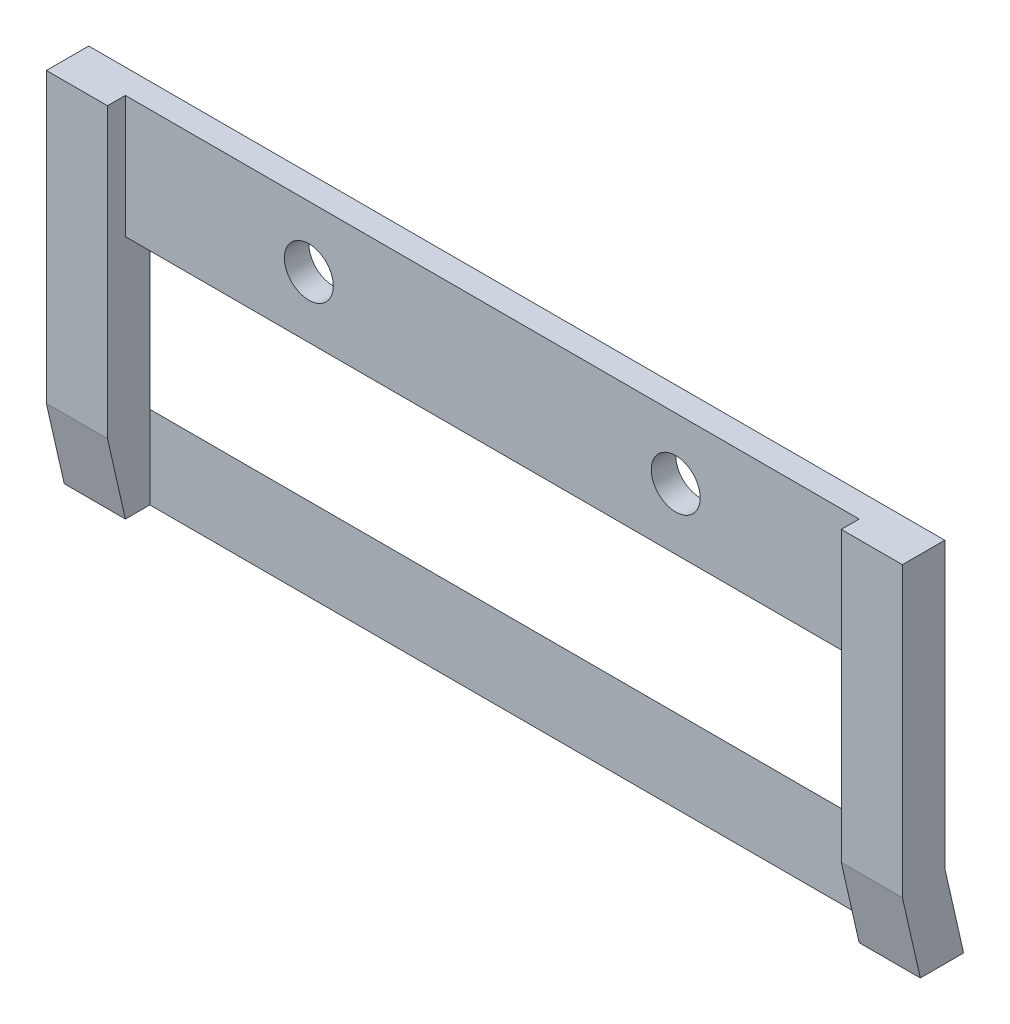
ISO-10303-21;
HEADER;
FILE_DESCRIPTION(('STEP AP214'),'2;1');
FILE_NAME('part.step','',(''),(''),'','','');
FILE_SCHEMA(('AUTOMOTIVE_DESIGN { 1 0 10303 214 1 1 1 1 }'));
ENDSEC;
DATA;
#1=APPLICATION_CONTEXT('core data for automotive mechanical design processes');
#2=APPLICATION_PROTOCOL_DEFINITION('international standard','automotive_design',2000,#1);
#3=PRODUCT_CONTEXT('',#1,'mechanical');
#4=PRODUCT('Part','Part','',(#3));
#5=PRODUCT_RELATED_PRODUCT_CATEGORY('part','',(#4));
#6=PRODUCT_DEFINITION_FORMATION('','',#4);
#7=PRODUCT_DEFINITION_CONTEXT('part definition',#1,'design');
#8=PRODUCT_DEFINITION('design','',#6,#7);
#9=PRODUCT_DEFINITION_SHAPE('','',#8);
#10=(LENGTH_UNIT() NAMED_UNIT(*) SI_UNIT(.MILLI.,.METRE.));
#11=(NAMED_UNIT(*) PLANE_ANGLE_UNIT() SI_UNIT($,.RADIAN.));
#12=(NAMED_UNIT(*) SI_UNIT($,.STERADIAN.) SOLID_ANGLE_UNIT());
#13=UNCERTAINTY_MEASURE_WITH_UNIT(LENGTH_MEASURE(1.E-05),#10,'distance_accuracy_value','');
#14=(GEOMETRIC_REPRESENTATION_CONTEXT(3) GLOBAL_UNCERTAINTY_ASSIGNED_CONTEXT((#13)) GLOBAL_UNIT_ASSIGNED_CONTEXT((#10,
#11,#12)) REPRESENTATION_CONTEXT('',''));
#15=CARTESIAN_POINT('',(0.,0.,0.));
#16=DIRECTION('',(0.,0.,1.));
#17=DIRECTION('',(1.,0.,0.));
#18=AXIS2_PLACEMENT_3D('',#15,#16,#17);
#19=CARTESIAN_POINT('',(0.,0.,0.));
#20=DIRECTION('',(0.,0.,-1.));
#21=DIRECTION('',(-1.,0.,0.));
#22=AXIS2_PLACEMENT_3D('',#19,#20,#21);
#23=PLANE('',#22);
#24=CARTESIAN_POINT('',(0.245106064920272,5.00000000000001,0.));
#25=DIRECTION('',(0.,0.,-1.));
#26=DIRECTION('',(-1.,0.,0.));
#27=AXIS2_PLACEMENT_3D('',#24,#25,#26);
#28=CIRCLE('',#27,2.);
#29=CARTESIAN_POINT('',(-1.75489393507973,5.00000000000001,0.));
#30=VERTEX_POINT('',#29);
#31=EDGE_CURVE('E38',#30,#30,#28,.F.);
#32=ORIENTED_EDGE('',*,*,#31,.T.);
#33=EDGE_LOOP('',(#32));
#34=FACE_BOUND('',#33,.T.);
#35=CARTESIAN_POINT('',(-29.7548939350797,5.,0.));
#36=DIRECTION('',(0.,0.,-1.));
#37=DIRECTION('',(-1.,0.,0.));
#38=AXIS2_PLACEMENT_3D('',#35,#36,#37);
#39=CIRCLE('',#38,2.);
#40=CARTESIAN_POINT('',(-31.7548939350797,5.,0.));
#41=VERTEX_POINT('',#40);
#42=EDGE_CURVE('E182',#41,#41,#39,.T.);
#43=ORIENTED_EDGE('',*,*,#42,.F.);
#44=EDGE_LOOP('',(#43));
#45=FACE_BOUND('',#44,.T.);
#46=DIRECTION('',(0.,1.,0.));
#47=VECTOR('',#46,1.);
#48=CARTESIAN_POINT('',(20.2451060649203,10.,0.));
#49=LINE('',#48,#47);
#50=CARTESIAN_POINT('',(20.2451060649203,-13.2253905657513,0.));
#51=VERTEX_POINT('',#50);
#52=CARTESIAN_POINT('',(20.2451060649203,10.,0.));
#53=VERTEX_POINT('',#52);
#54=EDGE_CURVE('E240',#51,#53,#49,.T.);
#55=ORIENTED_EDGE('',*,*,#54,.F.);
#56=DIRECTION('',(1.,0.,0.));
#57=VECTOR('',#56,1.);
#58=CARTESIAN_POINT('',(-51.7026371033491,-13.2253905657513,0.));
#59=LINE('',#58,#57);
#60=CARTESIAN_POINT('',(15.2451060649203,-13.2253905657513,0.));
#61=VERTEX_POINT('',#60);
#62=EDGE_CURVE('E167',#61,#51,#59,.T.);
#63=ORIENTED_EDGE('',*,*,#62,.F.);
#64=DIRECTION('',(0.,-1.,0.));
#65=VECTOR('',#64,1.);
#66=CARTESIAN_POINT('',(15.2451060649203,-20.,0.));
#67=LINE('',#66,#65);
#68=CARTESIAN_POINT('',(15.2451060649203,0.,0.));
#69=VERTEX_POINT('',#68);
#70=EDGE_CURVE('E237',#69,#61,#67,.T.);
#71=ORIENTED_EDGE('',*,*,#70,.F.);
#72=DIRECTION('',(1.,0.,0.));
#73=VECTOR('',#72,1.);
#74=CARTESIAN_POINT('',(-44.7548939350797,0.,0.));
#75=LINE('',#74,#73);
#76=CARTESIAN_POINT('',(-44.7548939350797,0.,0.));
#77=VERTEX_POINT('',#76);
#78=EDGE_CURVE('E145',#77,#69,#75,.T.);
#79=ORIENTED_EDGE('',*,*,#78,.F.);
#80=DIRECTION('',(0.,1.,0.));
#81=VECTOR('',#80,1.);
#82=CARTESIAN_POINT('',(-44.7548939350797,-20.,0.));
#83=LINE('',#82,#81);
#84=CARTESIAN_POINT('',(-44.7548939350797,-13.2253905657513,0.));
#85=VERTEX_POINT('',#84);
#86=EDGE_CURVE('E138',#85,#77,#83,.T.);
#87=ORIENTED_EDGE('',*,*,#86,.F.);
#88=DIRECTION('',(-1.,0.,0.));
#89=VECTOR('',#88,1.);
#90=CARTESIAN_POINT('',(-37.8071507668104,-13.2253905657513,0.));
#91=LINE('',#90,#89);
#92=CARTESIAN_POINT('',(-49.7548939350797,-13.2253905657513,0.));
#93=VERTEX_POINT('',#92);
#94=EDGE_CURVE('E142',#85,#93,#91,.T.);
#95=ORIENTED_EDGE('',*,*,#94,.T.);
#96=DIRECTION('',(0.,-1.,0.));
#97=VECTOR('',#96,1.);
#98=CARTESIAN_POINT('',(-49.7548939350797,9.99999999999999,0.));
#99=LINE('',#98,#97);
#100=CARTESIAN_POINT('',(-49.7548939350797,9.99999999999999,0.));
#101=VERTEX_POINT('',#100);
#102=EDGE_CURVE('E228',#101,#93,#99,.T.);
#103=ORIENTED_EDGE('',*,*,#102,.F.);
#104=DIRECTION('',(-1.,0.,0.));
#105=VECTOR('',#104,1.);
#106=CARTESIAN_POINT('',(-44.7548939350797,9.99999999999999,0.));
#107=LINE('',#106,#105);
#108=EDGE_CURVE('E242',#53,#101,#107,.T.);
#109=ORIENTED_EDGE('',*,*,#108,.F.);
#110=EDGE_LOOP('',(#55,#63,#71,#79,#87,#95,#103,#109));
#111=FACE_BOUND('',#110,.T.);
#112=ADVANCED_FACE('F34',(#34,#45,#111),#23,.T.);
#113=CARTESIAN_POINT('',(-44.7548939350797,-20.,2.));
#114=DIRECTION('',(-1.,0.,0.));
#115=DIRECTION('',(0.,0.,1.));
#116=AXIS2_PLACEMENT_3D('',#113,#114,#115);
#117=PLANE('',#116);
#118=DIRECTION('',(0.,1.,0.));
#119=VECTOR('',#118,1.);
#120=CARTESIAN_POINT('',(-44.7548939350797,-20.,0.));
#121=LINE('',#120,#119);
#122=CARTESIAN_POINT('',(-44.7548939350797,-20.,0.));
#123=VERTEX_POINT('',#122);
#124=EDGE_CURVE('E161',#123,#85,#121,.T.);
#125=ORIENTED_EDGE('',*,*,#124,.T.);
#126=ORIENTED_EDGE('',*,*,#86,.T.);
#127=DIRECTION('',(0.,0.,-1.));
#128=VECTOR('',#127,1.);
#129=CARTESIAN_POINT('',(-44.7548939350797,0.,2.));
#130=LINE('',#129,#128);
#131=CARTESIAN_POINT('',(-44.7548939350797,0.,2.));
#132=VERTEX_POINT('',#131);
#133=EDGE_CURVE('E11',#132,#77,#130,.T.);
#134=ORIENTED_EDGE('',*,*,#133,.F.);
#135=DIRECTION('',(0.,1.,0.));
#136=VECTOR('',#135,1.);
#137=CARTESIAN_POINT('',(-44.7548939350797,0.,2.));
#138=LINE('',#137,#136);
#139=CARTESIAN_POINT('',(-44.7548939350797,9.99999999999999,2.));
#140=VERTEX_POINT('',#139);
#141=EDGE_CURVE('E147',#132,#140,#138,.T.);
#142=ORIENTED_EDGE('',*,*,#141,.T.);
#143=DIRECTION('',(0.,0.,1.));
#144=VECTOR('',#143,1.);
#145=CARTESIAN_POINT('',(-44.7548939350797,9.99999999999999,3.46116455804052));
#146=LINE('',#145,#144);
#147=CARTESIAN_POINT('',(-44.7548939350797,10.,3.46116455804052));
#148=VERTEX_POINT('',#147);
#149=EDGE_CURVE('E212',#140,#148,#146,.T.);
#150=ORIENTED_EDGE('',*,*,#149,.T.);
#151=DIRECTION('',(0.,-1.,0.));
#152=VECTOR('',#151,1.);
#153=CARTESIAN_POINT('',(-44.7548939350797,-13.5778823566998,3.46116455804052));
#154=LINE('',#153,#152);
#155=CARTESIAN_POINT('',(-44.7548939350797,-13.5778823566998,3.46116455804052));
#156=VERTEX_POINT('',#155);
#157=EDGE_CURVE('E209',#148,#156,#154,.T.);
#158=ORIENTED_EDGE('',*,*,#157,.T.);
#159=DIRECTION('',(0.,-0.975080579430251,-0.221850994178448));
#160=VECTOR('',#159,1.);
#161=CARTESIAN_POINT('',(-44.7548939350797,-20.,2.));
#162=LINE('',#161,#160);
#163=CARTESIAN_POINT('',(-44.7548939350797,-20.,2.));
#164=VERTEX_POINT('',#163);
#165=EDGE_CURVE('E207',#156,#164,#162,.T.);
#166=ORIENTED_EDGE('',*,*,#165,.T.);
#167=DIRECTION('',(0.,0.,-1.));
#168=VECTOR('',#167,1.);
#169=CARTESIAN_POINT('',(-44.7548939350797,-20.,2.));
#170=LINE('',#169,#168);
#171=EDGE_CURVE('E59',#164,#123,#170,.T.);
#172=ORIENTED_EDGE('',*,*,#171,.T.);
#173=EDGE_LOOP('',(#125,#126,#134,#142,#150,#158,#166,#172));
#174=FACE_BOUND('',#173,.T.);
#175=ADVANCED_FACE('F36',(#174),#117,.F.);
#176=CARTESIAN_POINT('',(0.,0.,2.));
#177=DIRECTION('',(0.,0.,-1.));
#178=DIRECTION('',(-1.,0.,0.));
#179=AXIS2_PLACEMENT_3D('',#176,#177,#178);
#180=PLANE('',#179);
#181=CARTESIAN_POINT('',(0.245106064920272,5.00000000000001,2.));
#182=DIRECTION('',(0.,0.,-1.));
#183=DIRECTION('',(-1.,0.,0.));
#184=AXIS2_PLACEMENT_3D('',#181,#182,#183);
#185=CIRCLE('',#184,2.);
#186=CARTESIAN_POINT('',(-1.75489393507973,5.,2.));
#187=VERTEX_POINT('',#186);
#188=EDGE_CURVE('E175',#187,#187,#185,.T.);
#189=ORIENTED_EDGE('',*,*,#188,.T.);
#190=EDGE_LOOP('',(#189));
#191=FACE_BOUND('',#190,.T.);
#192=CARTESIAN_POINT('',(-29.7548939350797,5.,2.));
#193=DIRECTION('',(0.,0.,1.));
#194=DIRECTION('',(1.,0.,0.));
#195=AXIS2_PLACEMENT_3D('',#192,#193,#194);
#196=CIRCLE('',#195,2.);
#197=CARTESIAN_POINT('',(-27.7548939350797,5.,2.));
#198=VERTEX_POINT('',#197);
#199=EDGE_CURVE('E179',#198,#198,#196,.T.);
#200=ORIENTED_EDGE('',*,*,#199,.F.);
#201=EDGE_LOOP('',(#200));
#202=FACE_BOUND('',#201,.T.);
#203=DIRECTION('',(0.,1.,0.));
#204=VECTOR('',#203,1.);
#205=CARTESIAN_POINT('',(15.2451060649203,0.,2.));
#206=LINE('',#205,#204);
#207=CARTESIAN_POINT('',(15.2451060649203,0.,2.));
#208=VERTEX_POINT('',#207);
#209=CARTESIAN_POINT('',(15.2451060649203,10.,2.));
#210=VERTEX_POINT('',#209);
#211=EDGE_CURVE('E187',#208,#210,#206,.T.);
#212=ORIENTED_EDGE('',*,*,#211,.T.);
#213=DIRECTION('',(-1.,0.,0.));
#214=VECTOR('',#213,1.);
#215=CARTESIAN_POINT('',(15.2451060649203,10.,2.));
#216=LINE('',#215,#214);
#217=EDGE_CURVE('E231',#210,#140,#216,.T.);
#218=ORIENTED_EDGE('',*,*,#217,.T.);
#219=ORIENTED_EDGE('',*,*,#141,.F.);
#220=DIRECTION('',(1.,0.,0.));
#221=VECTOR('',#220,1.);
#222=CARTESIAN_POINT('',(-44.7548939350797,0.,2.));
#223=LINE('',#222,#221);
#224=EDGE_CURVE('E225',#132,#208,#223,.T.);
#225=ORIENTED_EDGE('',*,*,#224,.T.);
#226=EDGE_LOOP('',(#212,#218,#219,#225));
#227=FACE_BOUND('',#226,.T.);
#228=ADVANCED_FACE('F272',(#191,#202,#227),#180,.F.);
#229=CARTESIAN_POINT('',(-44.7548939350797,0.,2.));
#230=DIRECTION('',(0.,1.,0.));
#231=DIRECTION('',(0.,0.,1.));
#232=AXIS2_PLACEMENT_3D('',#229,#230,#231);
#233=PLANE('',#232);
#234=ORIENTED_EDGE('',*,*,#78,.T.);
#235=DIRECTION('',(0.,0.,-1.));
#236=VECTOR('',#235,1.);
#237=CARTESIAN_POINT('',(15.2451060649203,0.,2.));
#238=LINE('',#237,#236);
#239=EDGE_CURVE('E43',#208,#69,#238,.T.);
#240=ORIENTED_EDGE('',*,*,#239,.F.);
#241=ORIENTED_EDGE('',*,*,#224,.F.);
#242=ORIENTED_EDGE('',*,*,#133,.T.);
#243=EDGE_LOOP('',(#234,#240,#241,#242));
#244=FACE_BOUND('',#243,.T.);
#245=ADVANCED_FACE('F295',(#244),#233,.F.);
#246=CARTESIAN_POINT('',(15.2451060649203,-20.,2.));
#247=DIRECTION('',(1.,0.,0.));
#248=DIRECTION('',(0.,0.,-1.));
#249=AXIS2_PLACEMENT_3D('',#246,#247,#248);
#250=PLANE('',#249);
#251=ORIENTED_EDGE('',*,*,#70,.T.);
#252=DIRECTION('',(0.,1.,0.));
#253=VECTOR('',#252,1.);
#254=CARTESIAN_POINT('',(15.2451060649203,-20.,0.));
#255=LINE('',#254,#253);
#256=CARTESIAN_POINT('',(15.2451060649203,-20.,0.));
#257=VERTEX_POINT('',#256);
#258=EDGE_CURVE('E163',#257,#61,#255,.T.);
#259=ORIENTED_EDGE('',*,*,#258,.F.);
#260=DIRECTION('',(0.,0.,-1.));
#261=VECTOR('',#260,1.);
#262=CARTESIAN_POINT('',(15.2451060649203,-20.,2.));
#263=LINE('',#262,#261);
#264=CARTESIAN_POINT('',(15.2451060649203,-20.,2.));
#265=VERTEX_POINT('',#264);
#266=EDGE_CURVE('E256',#265,#257,#263,.T.);
#267=ORIENTED_EDGE('',*,*,#266,.F.);
#268=DIRECTION('',(0.,-0.975080579430251,-0.221850994178448));
#269=VECTOR('',#268,1.);
#270=CARTESIAN_POINT('',(15.2451060649203,-1.41700246426072,6.22801619177804));
#271=LINE('',#270,#269);
#272=CARTESIAN_POINT('',(15.2451060649203,-13.5778823566998,3.46116455804052));
#273=VERTEX_POINT('',#272);
#274=EDGE_CURVE('E190',#273,#265,#271,.T.);
#275=ORIENTED_EDGE('',*,*,#274,.F.);
#276=DIRECTION('',(0.,-1.,0.));
#277=VECTOR('',#276,1.);
#278=CARTESIAN_POINT('',(15.2451060649203,0.,3.46116455804052));
#279=LINE('',#278,#277);
#280=CARTESIAN_POINT('',(15.2451060649203,10.,3.46116455804052));
#281=VERTEX_POINT('',#280);
#282=EDGE_CURVE('E186',#281,#273,#279,.T.);
#283=ORIENTED_EDGE('',*,*,#282,.F.);
#284=DIRECTION('',(0.,0.,1.));
#285=VECTOR('',#284,1.);
#286=CARTESIAN_POINT('',(15.2451060649203,10.,0.));
#287=LINE('',#286,#285);
#288=EDGE_CURVE('E183',#210,#281,#287,.T.);
#289=ORIENTED_EDGE('',*,*,#288,.F.);
#290=ORIENTED_EDGE('',*,*,#211,.F.);
#291=ORIENTED_EDGE('',*,*,#239,.T.);
#292=EDGE_LOOP('',(#251,#259,#267,#275,#283,#289,#290,#291));
#293=FACE_BOUND('',#292,.T.);
#294=ADVANCED_FACE('F293',(#293),#250,.F.);
#295=CARTESIAN_POINT('',(20.2451060649203,10.,2.));
#296=DIRECTION('',(-1.,0.,0.));
#297=DIRECTION('',(0.,-1.,0.));
#298=AXIS2_PLACEMENT_3D('',#295,#296,#297);
#299=PLANE('',#298);
#300=DIRECTION('',(0.,0.,-1.));
#301=VECTOR('',#300,1.);
#302=CARTESIAN_POINT('',(20.2451060649203,-20.,2.));
#303=LINE('',#302,#301);
#304=CARTESIAN_POINT('',(20.2451060649203,-20.,2.));
#305=VERTEX_POINT('',#304);
#306=CARTESIAN_POINT('',(20.2451060649203,-20.,-1.54136372917708));
#307=VERTEX_POINT('',#306);
#308=EDGE_CURVE('E254',#305,#307,#303,.T.);
#309=ORIENTED_EDGE('',*,*,#308,.T.);
#310=DIRECTION('',(0.,-0.975080579430251,-0.221850994178448));
#311=VECTOR('',#310,1.);
#312=CARTESIAN_POINT('',(20.2451060649203,-13.2253905657513,0.));
#313=LINE('',#312,#311);
#314=EDGE_CURVE('E51',#51,#307,#313,.T.);
#315=ORIENTED_EDGE('',*,*,#314,.F.);
#316=ORIENTED_EDGE('',*,*,#54,.T.);
#317=DIRECTION('',(0.,0.,-1.));
#318=VECTOR('',#317,1.);
#319=CARTESIAN_POINT('',(20.2451060649203,10.,2.));
#320=LINE('',#319,#318);
#321=CARTESIAN_POINT('',(20.2451060649203,10.,3.46116455804052));
#322=VERTEX_POINT('',#321);
#323=EDGE_CURVE('E251',#322,#53,#320,.T.);
#324=ORIENTED_EDGE('',*,*,#323,.F.);
#325=DIRECTION('',(0.,1.,0.));
#326=VECTOR('',#325,1.);
#327=CARTESIAN_POINT('',(20.2451060649203,0.,3.46116455804052));
#328=LINE('',#327,#326);
#329=CARTESIAN_POINT('',(20.2451060649203,-13.5778823566998,3.46116455804052));
#330=VERTEX_POINT('',#329);
#331=EDGE_CURVE('E197',#330,#322,#328,.T.);
#332=ORIENTED_EDGE('',*,*,#331,.F.);
#333=DIRECTION('',(0.,0.975080579430251,0.221850994178448));
#334=VECTOR('',#333,1.);
#335=CARTESIAN_POINT('',(20.2451060649203,-1.41700246426071,6.22801619177804));
#336=LINE('',#335,#334);
#337=EDGE_CURVE('E194',#305,#330,#336,.T.);
#338=ORIENTED_EDGE('',*,*,#337,.F.);
#339=EDGE_LOOP('',(#309,#315,#316,#324,#332,#338));
#340=FACE_BOUND('',#339,.T.);
#341=ADVANCED_FACE('F289',(#340),#299,.F.);
#342=CARTESIAN_POINT('',(-44.7548939350797,9.99999999999999,2.));
#343=DIRECTION('',(0.,-1.,0.));
#344=DIRECTION('',(0.,0.,-1.));
#345=AXIS2_PLACEMENT_3D('',#342,#343,#344);
#346=PLANE('',#345);
#347=DIRECTION('',(0.,0.,-1.));
#348=VECTOR('',#347,1.);
#349=CARTESIAN_POINT('',(-49.7548939350797,9.99999999999999,2.));
#350=LINE('',#349,#348);
#351=CARTESIAN_POINT('',(-49.7548939350797,9.99999999999999,3.46116455804052));
#352=VERTEX_POINT('',#351);
#353=EDGE_CURVE('E248',#352,#101,#350,.T.);
#354=ORIENTED_EDGE('',*,*,#353,.F.);
#355=DIRECTION('',(-1.,0.,0.));
#356=VECTOR('',#355,1.);
#357=CARTESIAN_POINT('',(-14.5558929566064,10.,3.46116455804052));
#358=LINE('',#357,#356);
#359=EDGE_CURVE('E210',#148,#352,#358,.T.);
#360=ORIENTED_EDGE('',*,*,#359,.F.);
#361=ORIENTED_EDGE('',*,*,#149,.F.);
#362=ORIENTED_EDGE('',*,*,#217,.F.);
#363=ORIENTED_EDGE('',*,*,#288,.T.);
#364=DIRECTION('',(1.,0.,0.));
#365=VECTOR('',#364,1.);
#366=CARTESIAN_POINT('',(-14.7904562215706,10.,3.46116455804052));
#367=LINE('',#366,#365);
#368=EDGE_CURVE('E200',#281,#322,#367,.T.);
#369=ORIENTED_EDGE('',*,*,#368,.T.);
#370=ORIENTED_EDGE('',*,*,#323,.T.);
#371=ORIENTED_EDGE('',*,*,#108,.T.);
#372=EDGE_LOOP('',(#354,#360,#361,#362,#363,#369,#370,#371));
#373=FACE_BOUND('',#372,.T.);
#374=ADVANCED_FACE('F285',(#373),#346,.F.);
#375=CARTESIAN_POINT('',(-49.7548939350797,9.99999999999999,2.));
#376=DIRECTION('',(1.,0.,0.));
#377=DIRECTION('',(0.,1.,0.));
#378=AXIS2_PLACEMENT_3D('',#375,#376,#377);
#379=PLANE('',#378);
#380=ORIENTED_EDGE('',*,*,#102,.T.);
#381=DIRECTION('',(0.,-0.975080579430251,-0.221850994178448));
#382=VECTOR('',#381,1.);
#383=CARTESIAN_POINT('',(-49.7548939350797,-13.2253905657513,0.));
#384=LINE('',#383,#382);
#385=CARTESIAN_POINT('',(-49.7548939350797,-20.,-1.54136372917708));
#386=VERTEX_POINT('',#385);
#387=EDGE_CURVE('E157',#93,#386,#384,.T.);
#388=ORIENTED_EDGE('',*,*,#387,.T.);
#389=DIRECTION('',(0.,0.,-1.));
#390=VECTOR('',#389,1.);
#391=CARTESIAN_POINT('',(-49.7548939350797,-20.,2.));
#392=LINE('',#391,#390);
#393=CARTESIAN_POINT('',(-49.7548939350797,-20.,2.));
#394=VERTEX_POINT('',#393);
#395=EDGE_CURVE('E246',#394,#386,#392,.T.);
#396=ORIENTED_EDGE('',*,*,#395,.F.);
#397=DIRECTION('',(0.,0.975080579430251,0.221850994178448));
#398=VECTOR('',#397,1.);
#399=CARTESIAN_POINT('',(-49.7548939350797,-20.,2.));
#400=LINE('',#399,#398);
#401=CARTESIAN_POINT('',(-49.7548939350797,-13.5778823566998,3.46116455804052));
#402=VERTEX_POINT('',#401);
#403=EDGE_CURVE('E193',#394,#402,#400,.T.);
#404=ORIENTED_EDGE('',*,*,#403,.T.);
#405=DIRECTION('',(0.,1.,0.));
#406=VECTOR('',#405,1.);
#407=CARTESIAN_POINT('',(-49.7548939350797,-13.5778823566998,3.46116455804052));
#408=LINE('',#407,#406);
#409=EDGE_CURVE('E216',#402,#352,#408,.T.);
#410=ORIENTED_EDGE('',*,*,#409,.T.);
#411=ORIENTED_EDGE('',*,*,#353,.T.);
#412=EDGE_LOOP('',(#380,#388,#396,#404,#410,#411));
#413=FACE_BOUND('',#412,.T.);
#414=ADVANCED_FACE('F281',(#413),#379,.F.);
#415=CARTESIAN_POINT('',(-49.7548939350797,-20.,2.));
#416=DIRECTION('',(0.,1.,0.));
#417=DIRECTION('',(0.,0.,1.));
#418=AXIS2_PLACEMENT_3D('',#415,#416,#417);
#419=PLANE('',#418);
#420=ORIENTED_EDGE('',*,*,#395,.T.);
#421=DIRECTION('',(-1.,0.,0.));
#422=VECTOR('',#421,1.);
#423=CARTESIAN_POINT('',(-37.8071507668103,-20.,-1.54136372917708));
#424=LINE('',#423,#422);
#425=EDGE_CURVE('E158',#307,#386,#424,.T.);
#426=ORIENTED_EDGE('',*,*,#425,.F.);
#427=ORIENTED_EDGE('',*,*,#308,.F.);
#428=DIRECTION('',(1.,0.,0.));
#429=VECTOR('',#428,1.);
#430=CARTESIAN_POINT('',(20.2451060649203,-20.,2.));
#431=LINE('',#430,#429);
#432=EDGE_CURVE('E227',#265,#305,#431,.T.);
#433=ORIENTED_EDGE('',*,*,#432,.F.);
#434=ORIENTED_EDGE('',*,*,#266,.T.);
#435=DIRECTION('',(1.,0.,0.));
#436=VECTOR('',#435,1.);
#437=CARTESIAN_POINT('',(-51.7026371033491,-20.,0.));
#438=LINE('',#437,#436);
#439=EDGE_CURVE('E170',#123,#257,#438,.T.);
#440=ORIENTED_EDGE('',*,*,#439,.F.);
#441=ORIENTED_EDGE('',*,*,#171,.F.);
#442=DIRECTION('',(1.,0.,0.));
#443=VECTOR('',#442,1.);
#444=CARTESIAN_POINT('',(-49.7548939350797,-20.,2.));
#445=LINE('',#444,#443);
#446=EDGE_CURVE('E233',#394,#164,#445,.T.);
#447=ORIENTED_EDGE('',*,*,#446,.F.);
#448=EDGE_LOOP('',(#420,#426,#427,#433,#434,#440,#441,#447));
#449=FACE_BOUND('',#448,.T.);
#450=ADVANCED_FACE('F277',(#449),#419,.F.);
#451=CARTESIAN_POINT('',(-14.5558929566064,-13.5778823566998,3.46116455804052));
#452=DIRECTION('',(0.,0.,1.));
#453=DIRECTION('',(1.,0.,0.));
#454=AXIS2_PLACEMENT_3D('',#451,#452,#453);
#455=PLANE('',#454);
#456=ORIENTED_EDGE('',*,*,#157,.F.);
#457=ORIENTED_EDGE('',*,*,#359,.T.);
#458=ORIENTED_EDGE('',*,*,#409,.F.);
#459=DIRECTION('',(-1.,0.,0.));
#460=VECTOR('',#459,1.);
#461=CARTESIAN_POINT('',(-14.5558929566064,-13.5778823566998,3.46116455804052));
#462=LINE('',#461,#460);
#463=EDGE_CURVE('E219',#156,#402,#462,.T.);
#464=ORIENTED_EDGE('',*,*,#463,.F.);
#465=EDGE_LOOP('',(#456,#457,#458,#464));
#466=FACE_BOUND('',#465,.T.);
#467=ADVANCED_FACE('F280',(#466),#455,.T.);
#468=CARTESIAN_POINT('',(-14.5558929566063,-20.,2.));
#469=DIRECTION('',(0.,-0.221850994178448,0.975080579430251));
#470=DIRECTION('',(0.,-0.975080579430251,-0.221850994178448));
#471=AXIS2_PLACEMENT_3D('',#468,#469,#470);
#472=PLANE('',#471);
#473=ORIENTED_EDGE('',*,*,#165,.F.);
#474=ORIENTED_EDGE('',*,*,#463,.T.);
#475=ORIENTED_EDGE('',*,*,#403,.F.);
#476=ORIENTED_EDGE('',*,*,#446,.T.);
#477=EDGE_LOOP('',(#473,#474,#475,#476));
#478=FACE_BOUND('',#477,.T.);
#479=ADVANCED_FACE('F329',(#478),#472,.T.);
#480=CARTESIAN_POINT('',(-14.7904562215706,0.,3.46116455804052));
#481=DIRECTION('',(0.,0.,-1.));
#482=DIRECTION('',(-1.,0.,0.));
#483=AXIS2_PLACEMENT_3D('',#480,#481,#482);
#484=PLANE('',#483);
#485=ORIENTED_EDGE('',*,*,#368,.F.);
#486=ORIENTED_EDGE('',*,*,#282,.T.);
#487=DIRECTION('',(1.,0.,0.));
#488=VECTOR('',#487,1.);
#489=CARTESIAN_POINT('',(-14.7904562215706,-13.5778823566998,3.46116455804052));
#490=LINE('',#489,#488);
#491=EDGE_CURVE('E201',#273,#330,#490,.T.);
#492=ORIENTED_EDGE('',*,*,#491,.T.);
#493=ORIENTED_EDGE('',*,*,#331,.T.);
#494=EDGE_LOOP('',(#485,#486,#492,#493));
#495=FACE_BOUND('',#494,.T.);
#496=ADVANCED_FACE('F318',(#495),#484,.F.);
#497=CARTESIAN_POINT('',(-14.7904562215706,-1.41700246426072,6.22801619177804));
#498=DIRECTION('',(0.,0.221850994178448,-0.975080579430251));
#499=DIRECTION('',(0.,0.975080579430251,0.221850994178448));
#500=AXIS2_PLACEMENT_3D('',#497,#498,#499);
#501=PLANE('',#500);
#502=ORIENTED_EDGE('',*,*,#491,.F.);
#503=ORIENTED_EDGE('',*,*,#274,.T.);
#504=ORIENTED_EDGE('',*,*,#432,.T.);
#505=ORIENTED_EDGE('',*,*,#337,.T.);
#506=EDGE_LOOP('',(#502,#503,#504,#505));
#507=FACE_BOUND('',#506,.T.);
#508=ADVANCED_FACE('F316',(#507),#501,.F.);
#509=CARTESIAN_POINT('',(-29.7548939350797,5.,-8.));
#510=DIRECTION('',(0.,0.,1.));
#511=DIRECTION('',(1.,0.,0.));
#512=AXIS2_PLACEMENT_3D('',#509,#510,#511);
#513=CYLINDRICAL_SURFACE('',#512,2.);
#514=ORIENTED_EDGE('',*,*,#42,.T.);
#515=EDGE_LOOP('',(#514));
#516=FACE_BOUND('',#515,.T.);
#517=ORIENTED_EDGE('',*,*,#199,.T.);
#518=EDGE_LOOP('',(#517));
#519=FACE_BOUND('',#518,.T.);
#520=ADVANCED_FACE('F263',(#516,#519),#513,.F.);
#521=CARTESIAN_POINT('',(0.245106064920272,5.00000000000001,-8.));
#522=DIRECTION('',(0.,0.,1.));
#523=DIRECTION('',(1.,0.,0.));
#524=AXIS2_PLACEMENT_3D('',#521,#522,#523);
#525=CYLINDRICAL_SURFACE('',#524,2.);
#526=ORIENTED_EDGE('',*,*,#31,.F.);
#527=EDGE_LOOP('',(#526));
#528=FACE_BOUND('',#527,.T.);
#529=ORIENTED_EDGE('',*,*,#188,.F.);
#530=EDGE_LOOP('',(#529));
#531=FACE_BOUND('',#530,.T.);
#532=ADVANCED_FACE('F342',(#528,#531),#525,.F.);
#533=CARTESIAN_POINT('',(-37.8071507668104,-13.2253905657513,0.));
#534=DIRECTION('',(0.,0.221850994178448,-0.975080579430251));
#535=DIRECTION('',(0.,0.975080579430251,0.221850994178448));
#536=AXIS2_PLACEMENT_3D('',#533,#534,#535);
#537=PLANE('',#536);
#538=ORIENTED_EDGE('',*,*,#94,.F.);
#539=EDGE_CURVE('E153',#85,#61,#59,.T.);
#540=ORIENTED_EDGE('',*,*,#539,.T.);
#541=ORIENTED_EDGE('',*,*,#62,.T.);
#542=ORIENTED_EDGE('',*,*,#314,.T.);
#543=ORIENTED_EDGE('',*,*,#425,.T.);
#544=ORIENTED_EDGE('',*,*,#387,.F.);
#545=EDGE_LOOP('',(#538,#540,#541,#542,#543,#544));
#546=FACE_BOUND('',#545,.T.);
#547=ADVANCED_FACE('F151',(#546),#537,.T.);
#548=CARTESIAN_POINT('',(-51.7026371033491,-20.,0.));
#549=DIRECTION('',(0.,0.,-1.));
#550=DIRECTION('',(-1.,0.,0.));
#551=AXIS2_PLACEMENT_3D('',#548,#549,#550);
#552=PLANE('',#551);
#553=ORIENTED_EDGE('',*,*,#439,.T.);
#554=ORIENTED_EDGE('',*,*,#258,.T.);
#555=ORIENTED_EDGE('',*,*,#539,.F.);
#556=ORIENTED_EDGE('',*,*,#124,.F.);
#557=EDGE_LOOP('',(#553,#554,#555,#556));
#558=FACE_BOUND('',#557,.T.);
#559=ADVANCED_FACE('F165',(#558),#552,.F.);
#560=CLOSED_SHELL('',(#112,#175,#228,#245,#294,#341,#374,#414,#450,#467,#479,#496,#508,#520,
#532,#547,#559));
#561=MANIFOLD_SOLID_BREP('B2',#560);
#562=ADVANCED_BREP_SHAPE_REPRESENTATION('',(#18,#561),#14);
#563=SHAPE_DEFINITION_REPRESENTATION(#9,#562);
ENDSEC;
END-ISO-10303-21;
